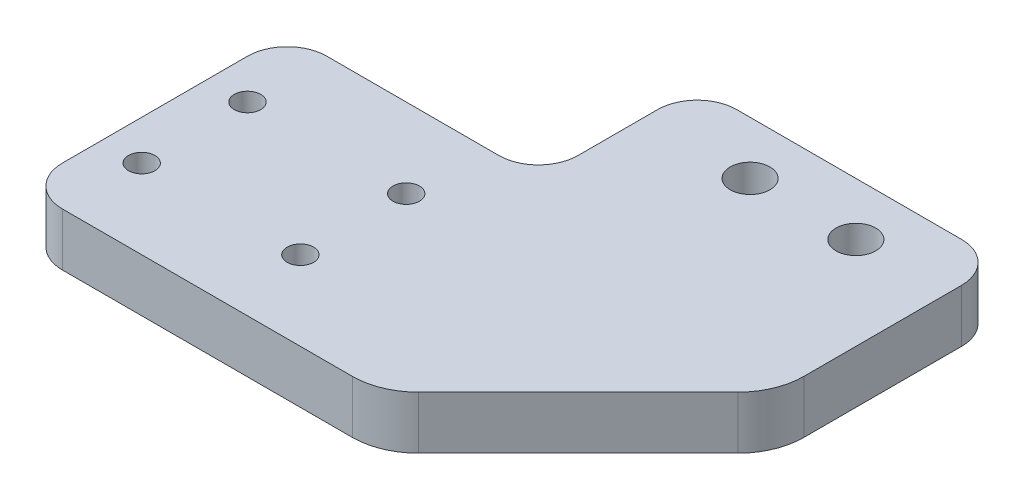
ISO-10303-21;
HEADER;
FILE_DESCRIPTION(('STEP AP214'),'2;1');
FILE_NAME('part.step','',(''),(''),'','','');
FILE_SCHEMA(('AUTOMOTIVE_DESIGN { 1 0 10303 214 1 1 1 1 }'));
ENDSEC;
DATA;
#1=APPLICATION_CONTEXT('core data for automotive mechanical design processes');
#2=APPLICATION_PROTOCOL_DEFINITION('international standard','automotive_design',2000,#1);
#3=PRODUCT_CONTEXT('',#1,'mechanical');
#4=PRODUCT('Part','Part','',(#3));
#5=PRODUCT_RELATED_PRODUCT_CATEGORY('part','',(#4));
#6=PRODUCT_DEFINITION_FORMATION('','',#4);
#7=PRODUCT_DEFINITION_CONTEXT('part definition',#1,'design');
#8=PRODUCT_DEFINITION('design','',#6,#7);
#9=PRODUCT_DEFINITION_SHAPE('','',#8);
#10=(LENGTH_UNIT() NAMED_UNIT(*) SI_UNIT(.MILLI.,.METRE.));
#11=(NAMED_UNIT(*) PLANE_ANGLE_UNIT() SI_UNIT($,.RADIAN.));
#12=(NAMED_UNIT(*) SI_UNIT($,.STERADIAN.) SOLID_ANGLE_UNIT());
#13=UNCERTAINTY_MEASURE_WITH_UNIT(LENGTH_MEASURE(1.E-05),#10,'distance_accuracy_value','');
#14=(GEOMETRIC_REPRESENTATION_CONTEXT(3) GLOBAL_UNCERTAINTY_ASSIGNED_CONTEXT((#13)) GLOBAL_UNIT_ASSIGNED_CONTEXT((#10,
#11,#12)) REPRESENTATION_CONTEXT('',''));
#15=CARTESIAN_POINT('',(0.,0.,0.));
#16=DIRECTION('',(0.,0.,1.));
#17=DIRECTION('',(1.,0.,0.));
#18=AXIS2_PLACEMENT_3D('',#15,#16,#17);
#19=CARTESIAN_POINT('',(0.,4.,10.));
#20=DIRECTION('',(0.,0.,1.));
#21=DIRECTION('',(1.,0.,0.));
#22=AXIS2_PLACEMENT_3D('',#19,#20,#21);
#23=PLANE('',#22);
#24=DIRECTION('',(-1.,0.,0.));
#25=VECTOR('',#24,1.);
#26=CARTESIAN_POINT('',(0.,0.,10.));
#27=LINE('',#26,#25);
#28=CARTESIAN_POINT('',(45.9289321881345,0.,10.));
#29=VERTEX_POINT('',#28);
#30=CARTESIAN_POINT('',(24.,0.,10.));
#31=VERTEX_POINT('',#30);
#32=EDGE_CURVE('E257',#29,#31,#27,.T.);
#33=ORIENTED_EDGE('',*,*,#32,.F.);
#34=DIRECTION('',(0.,-1.,0.));
#35=VECTOR('',#34,1.);
#36=CARTESIAN_POINT('',(45.9289321881345,4.,10.));
#37=LINE('',#36,#35);
#38=CARTESIAN_POINT('',(45.9289321881345,4.,10.));
#39=VERTEX_POINT('',#38);
#40=EDGE_CURVE('E11',#29,#39,#37,.F.);
#41=ORIENTED_EDGE('',*,*,#40,.T.);
#42=DIRECTION('',(-1.,0.,0.));
#43=VECTOR('',#42,1.);
#44=CARTESIAN_POINT('',(0.,4.,10.));
#45=LINE('',#44,#43);
#46=CARTESIAN_POINT('',(24.,4.,10.));
#47=VERTEX_POINT('',#46);
#48=EDGE_CURVE('E251',#39,#47,#45,.T.);
#49=ORIENTED_EDGE('',*,*,#48,.T.);
#50=DIRECTION('',(0.,-1.,0.));
#51=VECTOR('',#50,1.);
#52=CARTESIAN_POINT('',(24.,0.,10.));
#53=LINE('',#52,#51);
#54=EDGE_CURVE('E209',#47,#31,#53,.T.);
#55=ORIENTED_EDGE('',*,*,#54,.T.);
#56=EDGE_LOOP('',(#33,#41,#49,#55));
#57=FACE_BOUND('',#56,.T.);
#58=ADVANCED_FACE('F45',(#57),#23,.T.);
#59=CARTESIAN_POINT('',(63.,4.,0.));
#60=DIRECTION('',(1.,0.,0.));
#61=DIRECTION('',(0.,0.,-1.));
#62=AXIS2_PLACEMENT_3D('',#59,#60,#61);
#63=PLANE('',#62);
#64=DIRECTION('',(0.,0.,1.));
#65=VECTOR('',#64,1.);
#66=CARTESIAN_POINT('',(63.,4.,0.));
#67=LINE('',#66,#65);
#68=CARTESIAN_POINT('',(63.,4.,-19.));
#69=VERTEX_POINT('',#68);
#70=CARTESIAN_POINT('',(63.,4.,-7.07106781186549));
#71=VERTEX_POINT('',#70);
#72=EDGE_CURVE('E242',#69,#71,#67,.T.);
#73=ORIENTED_EDGE('',*,*,#72,.T.);
#74=DIRECTION('',(0.,1.,0.));
#75=VECTOR('',#74,1.);
#76=CARTESIAN_POINT('',(63.,4.,-7.07106781186549));
#77=LINE('',#76,#75);
#78=CARTESIAN_POINT('',(63.,0.,-7.07106781186549));
#79=VERTEX_POINT('',#78);
#80=EDGE_CURVE('E226',#71,#79,#77,.F.);
#81=ORIENTED_EDGE('',*,*,#80,.T.);
#82=DIRECTION('',(0.,0.,1.));
#83=VECTOR('',#82,1.);
#84=CARTESIAN_POINT('',(63.,0.,0.));
#85=LINE('',#84,#83);
#86=CARTESIAN_POINT('',(63.,0.,-19.));
#87=VERTEX_POINT('',#86);
#88=EDGE_CURVE('E171',#87,#79,#85,.T.);
#89=ORIENTED_EDGE('',*,*,#88,.F.);
#90=DIRECTION('',(0.,-1.,0.));
#91=VECTOR('',#90,1.);
#92=CARTESIAN_POINT('',(63.,4.,-19.));
#93=LINE('',#92,#91);
#94=EDGE_CURVE('E190',#87,#69,#93,.F.);
#95=ORIENTED_EDGE('',*,*,#94,.T.);
#96=EDGE_LOOP('',(#73,#81,#89,#95));
#97=FACE_BOUND('',#96,.T.);
#98=ADVANCED_FACE('F247',(#97),#63,.T.);
#99=CARTESIAN_POINT('',(0.,4.,-22.));
#100=DIRECTION('',(0.,0.,-1.));
#101=DIRECTION('',(-1.,0.,0.));
#102=AXIS2_PLACEMENT_3D('',#99,#100,#101);
#103=PLANE('',#102);
#104=DIRECTION('',(1.,0.,0.));
#105=VECTOR('',#104,1.);
#106=CARTESIAN_POINT('',(0.,4.,-22.));
#107=LINE('',#106,#105);
#108=CARTESIAN_POINT('',(43.,4.,-22.));
#109=VERTEX_POINT('',#108);
#110=CARTESIAN_POINT('',(60.,4.,-22.));
#111=VERTEX_POINT('',#110);
#112=EDGE_CURVE('E250',#109,#111,#107,.T.);
#113=ORIENTED_EDGE('',*,*,#112,.T.);
#114=DIRECTION('',(0.,-1.,0.));
#115=VECTOR('',#114,1.);
#116=CARTESIAN_POINT('',(60.,4.,-22.));
#117=LINE('',#116,#115);
#118=CARTESIAN_POINT('',(60.,0.,-22.));
#119=VERTEX_POINT('',#118);
#120=EDGE_CURVE('E170',#111,#119,#117,.T.);
#121=ORIENTED_EDGE('',*,*,#120,.T.);
#122=DIRECTION('',(1.,0.,0.));
#123=VECTOR('',#122,1.);
#124=CARTESIAN_POINT('',(0.,0.,-22.));
#125=LINE('',#124,#123);
#126=CARTESIAN_POINT('',(43.,0.,-22.));
#127=VERTEX_POINT('',#126);
#128=EDGE_CURVE('E153',#127,#119,#125,.T.);
#129=ORIENTED_EDGE('',*,*,#128,.F.);
#130=DIRECTION('',(0.,-1.,0.));
#131=VECTOR('',#130,1.);
#132=CARTESIAN_POINT('',(43.,4.,-22.));
#133=LINE('',#132,#131);
#134=EDGE_CURVE('E167',#127,#109,#133,.F.);
#135=ORIENTED_EDGE('',*,*,#134,.T.);
#136=EDGE_LOOP('',(#113,#121,#129,#135));
#137=FACE_BOUND('',#136,.T.);
#138=ADVANCED_FACE('F166',(#137),#103,.T.);
#139=CARTESIAN_POINT('',(40.,4.,0.));
#140=DIRECTION('',(-1.,0.,0.));
#141=DIRECTION('',(0.,0.,1.));
#142=AXIS2_PLACEMENT_3D('',#139,#140,#141);
#143=PLANE('',#142);
#144=DIRECTION('',(0.,0.,-1.));
#145=VECTOR('',#144,1.);
#146=CARTESIAN_POINT('',(40.,4.,0.));
#147=LINE('',#146,#145);
#148=CARTESIAN_POINT('',(40.,4.,-13.));
#149=VERTEX_POINT('',#148);
#150=CARTESIAN_POINT('',(40.,4.,-19.));
#151=VERTEX_POINT('',#150);
#152=EDGE_CURVE('E294',#149,#151,#147,.T.);
#153=ORIENTED_EDGE('',*,*,#152,.T.);
#154=DIRECTION('',(0.,-1.,0.));
#155=VECTOR('',#154,1.);
#156=CARTESIAN_POINT('',(40.,4.,-19.));
#157=LINE('',#156,#155);
#158=CARTESIAN_POINT('',(40.,0.,-19.));
#159=VERTEX_POINT('',#158);
#160=EDGE_CURVE('E202',#151,#159,#157,.T.);
#161=ORIENTED_EDGE('',*,*,#160,.T.);
#162=DIRECTION('',(0.,0.,-1.));
#163=VECTOR('',#162,1.);
#164=CARTESIAN_POINT('',(40.,0.,0.));
#165=LINE('',#164,#163);
#166=CARTESIAN_POINT('',(40.,0.,-13.));
#167=VERTEX_POINT('',#166);
#168=EDGE_CURVE('E155',#167,#159,#165,.T.);
#169=ORIENTED_EDGE('',*,*,#168,.F.);
#170=DIRECTION('',(0.,-1.,0.));
#171=VECTOR('',#170,1.);
#172=CARTESIAN_POINT('',(40.,4.,-13.));
#173=LINE('',#172,#171);
#174=EDGE_CURVE('E200',#167,#149,#173,.F.);
#175=ORIENTED_EDGE('',*,*,#174,.T.);
#176=EDGE_LOOP('',(#153,#161,#169,#175));
#177=FACE_BOUND('',#176,.T.);
#178=ADVANCED_FACE('F448',(#177),#143,.T.);
#179=CARTESIAN_POINT('',(0.,4.,-10.));
#180=DIRECTION('',(0.,0.,-1.));
#181=DIRECTION('',(-1.,0.,0.));
#182=AXIS2_PLACEMENT_3D('',#179,#180,#181);
#183=PLANE('',#182);
#184=DIRECTION('',(1.,0.,0.));
#185=VECTOR('',#184,1.);
#186=CARTESIAN_POINT('',(0.,4.,-10.));
#187=LINE('',#186,#185);
#188=CARTESIAN_POINT('',(24.,4.,-10.));
#189=VERTEX_POINT('',#188);
#190=CARTESIAN_POINT('',(37.,4.,-10.));
#191=VERTEX_POINT('',#190);
#192=EDGE_CURVE('E297',#189,#191,#187,.T.);
#193=ORIENTED_EDGE('',*,*,#192,.T.);
#194=DIRECTION('',(0.,-1.,0.));
#195=VECTOR('',#194,1.);
#196=CARTESIAN_POINT('',(37.,0.,-10.));
#197=LINE('',#196,#195);
#198=CARTESIAN_POINT('',(37.,0.,-10.));
#199=VERTEX_POINT('',#198);
#200=EDGE_CURVE('E206',#191,#199,#197,.T.);
#201=ORIENTED_EDGE('',*,*,#200,.T.);
#202=DIRECTION('',(1.,0.,0.));
#203=VECTOR('',#202,1.);
#204=CARTESIAN_POINT('',(0.,0.,-10.));
#205=LINE('',#204,#203);
#206=CARTESIAN_POINT('',(24.,0.,-10.));
#207=VERTEX_POINT('',#206);
#208=EDGE_CURVE('E267',#207,#199,#205,.T.);
#209=ORIENTED_EDGE('',*,*,#208,.F.);
#210=DIRECTION('',(0.,-1.,0.));
#211=VECTOR('',#210,1.);
#212=CARTESIAN_POINT('',(24.,4.,-10.));
#213=LINE('',#212,#211);
#214=EDGE_CURVE('E204',#207,#189,#213,.F.);
#215=ORIENTED_EDGE('',*,*,#214,.T.);
#216=EDGE_LOOP('',(#193,#201,#209,#215));
#217=FACE_BOUND('',#216,.T.);
#218=ADVANCED_FACE('F456',(#217),#183,.T.);
#219=CARTESIAN_POINT('',(56.,4.,-18.));
#220=DIRECTION('',(0.,-1.,0.));
#221=DIRECTION('',(0.,0.,-1.));
#222=AXIS2_PLACEMENT_3D('',#219,#220,#221);
#223=CYLINDRICAL_SURFACE('',#222,1.5);
#224=CARTESIAN_POINT('',(56.,4.,-18.));
#225=DIRECTION('',(0.,1.,0.));
#226=DIRECTION('',(0.,0.,1.));
#227=AXIS2_PLACEMENT_3D('',#224,#225,#226);
#228=CIRCLE('',#227,1.5);
#229=CARTESIAN_POINT('',(56.,4.,-16.5));
#230=VERTEX_POINT('',#229);
#231=EDGE_CURVE('E181',#230,#230,#228,.T.);
#232=ORIENTED_EDGE('',*,*,#231,.T.);
#233=EDGE_LOOP('',(#232));
#234=FACE_BOUND('',#233,.T.);
#235=CARTESIAN_POINT('',(56.,0.,-18.));
#236=DIRECTION('',(0.,1.,0.));
#237=DIRECTION('',(0.,0.,1.));
#238=AXIS2_PLACEMENT_3D('',#235,#236,#237);
#239=CIRCLE('',#238,1.5);
#240=CARTESIAN_POINT('',(56.,0.,-16.5));
#241=VERTEX_POINT('',#240);
#242=EDGE_CURVE('E284',#241,#241,#239,.T.);
#243=ORIENTED_EDGE('',*,*,#242,.F.);
#244=EDGE_LOOP('',(#243));
#245=FACE_BOUND('',#244,.T.);
#246=ADVANCED_FACE('F317',(#234,#245),#223,.F.);
#247=CARTESIAN_POINT('',(24.,4.,4.));
#248=DIRECTION('',(0.,-1.,0.));
#249=DIRECTION('',(0.,0.,-1.));
#250=AXIS2_PLACEMENT_3D('',#247,#248,#249);
#251=CYLINDRICAL_SURFACE('',#250,1.);
#252=CARTESIAN_POINT('',(24.,4.,4.));
#253=DIRECTION('',(0.,1.,0.));
#254=DIRECTION('',(0.,0.,1.));
#255=AXIS2_PLACEMENT_3D('',#252,#253,#254);
#256=CIRCLE('',#255,1.);
#257=CARTESIAN_POINT('',(24.,4.,5.));
#258=VERTEX_POINT('',#257);
#259=EDGE_CURVE('E312',#258,#258,#256,.F.);
#260=ORIENTED_EDGE('',*,*,#259,.F.);
#261=EDGE_LOOP('',(#260));
#262=FACE_BOUND('',#261,.T.);
#263=CARTESIAN_POINT('',(24.,0.,4.));
#264=DIRECTION('',(0.,1.,0.));
#265=DIRECTION('',(0.,0.,1.));
#266=AXIS2_PLACEMENT_3D('',#263,#264,#265);
#267=CIRCLE('',#266,1.);
#268=CARTESIAN_POINT('',(24.,0.,5.));
#269=VERTEX_POINT('',#268);
#270=EDGE_CURVE('E282',#269,#269,#267,.F.);
#271=ORIENTED_EDGE('',*,*,#270,.T.);
#272=EDGE_LOOP('',(#271));
#273=FACE_BOUND('',#272,.T.);
#274=ADVANCED_FACE('F475',(#262,#273),#251,.F.);
#275=CARTESIAN_POINT('',(36.,4.,4.));
#276=DIRECTION('',(0.,-1.,0.));
#277=DIRECTION('',(0.,0.,-1.));
#278=AXIS2_PLACEMENT_3D('',#275,#276,#277);
#279=CYLINDRICAL_SURFACE('',#278,0.999999999999998);
#280=CARTESIAN_POINT('',(36.,4.,4.));
#281=DIRECTION('',(0.,1.,0.));
#282=DIRECTION('',(0.,0.,1.));
#283=AXIS2_PLACEMENT_3D('',#280,#281,#282);
#284=CIRCLE('',#283,0.999999999999998);
#285=CARTESIAN_POINT('',(36.,4.,5.));
#286=VERTEX_POINT('',#285);
#287=EDGE_CURVE('E309',#286,#286,#284,.T.);
#288=ORIENTED_EDGE('',*,*,#287,.T.);
#289=EDGE_LOOP('',(#288));
#290=FACE_BOUND('',#289,.T.);
#291=CARTESIAN_POINT('',(36.,0.,4.));
#292=DIRECTION('',(0.,1.,0.));
#293=DIRECTION('',(0.,0.,1.));
#294=AXIS2_PLACEMENT_3D('',#291,#292,#293);
#295=CIRCLE('',#294,0.999999999999998);
#296=CARTESIAN_POINT('',(36.,0.,5.));
#297=VERTEX_POINT('',#296);
#298=EDGE_CURVE('E279',#297,#297,#295,.T.);
#299=ORIENTED_EDGE('',*,*,#298,.F.);
#300=EDGE_LOOP('',(#299));
#301=FACE_BOUND('',#300,.T.);
#302=ADVANCED_FACE('F483',(#290,#301),#279,.F.);
#303=CARTESIAN_POINT('',(24.,4.,-4.));
#304=DIRECTION('',(0.,-1.,0.));
#305=DIRECTION('',(0.,0.,-1.));
#306=AXIS2_PLACEMENT_3D('',#303,#304,#305);
#307=CYLINDRICAL_SURFACE('',#306,1.);
#308=CARTESIAN_POINT('',(24.,4.,-4.));
#309=DIRECTION('',(0.,1.,0.));
#310=DIRECTION('',(0.,0.,1.));
#311=AXIS2_PLACEMENT_3D('',#308,#309,#310);
#312=CIRCLE('',#311,1.);
#313=CARTESIAN_POINT('',(24.,4.,-3.));
#314=VERTEX_POINT('',#313);
#315=EDGE_CURVE('E306',#314,#314,#312,.T.);
#316=ORIENTED_EDGE('',*,*,#315,.T.);
#317=EDGE_LOOP('',(#316));
#318=FACE_BOUND('',#317,.T.);
#319=CARTESIAN_POINT('',(24.,0.,-4.));
#320=DIRECTION('',(0.,1.,0.));
#321=DIRECTION('',(0.,0.,1.));
#322=AXIS2_PLACEMENT_3D('',#319,#320,#321);
#323=CIRCLE('',#322,1.);
#324=CARTESIAN_POINT('',(24.,0.,-3.));
#325=VERTEX_POINT('',#324);
#326=EDGE_CURVE('E276',#325,#325,#323,.T.);
#327=ORIENTED_EDGE('',*,*,#326,.F.);
#328=EDGE_LOOP('',(#327));
#329=FACE_BOUND('',#328,.T.);
#330=ADVANCED_FACE('F493',(#318,#329),#307,.F.);
#331=CARTESIAN_POINT('',(36.,4.,-4.));
#332=DIRECTION('',(0.,-1.,0.));
#333=DIRECTION('',(0.,0.,-1.));
#334=AXIS2_PLACEMENT_3D('',#331,#332,#333);
#335=CYLINDRICAL_SURFACE('',#334,0.999999999999998);
#336=CARTESIAN_POINT('',(36.,4.,-4.));
#337=DIRECTION('',(0.,1.,0.));
#338=DIRECTION('',(0.,0.,1.));
#339=AXIS2_PLACEMENT_3D('',#336,#337,#338);
#340=CIRCLE('',#339,0.999999999999998);
#341=CARTESIAN_POINT('',(36.,4.,-3.));
#342=VERTEX_POINT('',#341);
#343=EDGE_CURVE('E303',#342,#342,#340,.F.);
#344=ORIENTED_EDGE('',*,*,#343,.F.);
#345=EDGE_LOOP('',(#344));
#346=FACE_BOUND('',#345,.T.);
#347=CARTESIAN_POINT('',(36.,0.,-4.));
#348=DIRECTION('',(0.,1.,0.));
#349=DIRECTION('',(0.,0.,1.));
#350=AXIS2_PLACEMENT_3D('',#347,#348,#349);
#351=CIRCLE('',#350,0.999999999999998);
#352=CARTESIAN_POINT('',(36.,0.,-3.));
#353=VERTEX_POINT('',#352);
#354=EDGE_CURVE('E273',#353,#353,#351,.F.);
#355=ORIENTED_EDGE('',*,*,#354,.T.);
#356=EDGE_LOOP('',(#355));
#357=FACE_BOUND('',#356,.T.);
#358=ADVANCED_FACE('F335',(#346,#357),#335,.F.);
#359=CARTESIAN_POINT('',(21.,4.,0.));
#360=DIRECTION('',(1.,0.,0.));
#361=DIRECTION('',(0.,0.,-1.));
#362=AXIS2_PLACEMENT_3D('',#359,#360,#361);
#363=PLANE('',#362);
#364=DIRECTION('',(0.,0.,1.));
#365=VECTOR('',#364,1.);
#366=CARTESIAN_POINT('',(21.,0.,0.));
#367=LINE('',#366,#365);
#368=CARTESIAN_POINT('',(21.,0.,-7.));
#369=VERTEX_POINT('',#368);
#370=CARTESIAN_POINT('',(21.,0.,7.));
#371=VERTEX_POINT('',#370);
#372=EDGE_CURVE('E270',#369,#371,#367,.T.);
#373=ORIENTED_EDGE('',*,*,#372,.T.);
#374=DIRECTION('',(0.,-1.,0.));
#375=VECTOR('',#374,1.);
#376=CARTESIAN_POINT('',(21.,4.,7.));
#377=LINE('',#376,#375);
#378=CARTESIAN_POINT('',(21.,4.,7.));
#379=VERTEX_POINT('',#378);
#380=EDGE_CURVE('E215',#371,#379,#377,.F.);
#381=ORIENTED_EDGE('',*,*,#380,.T.);
#382=DIRECTION('',(0.,0.,1.));
#383=VECTOR('',#382,1.);
#384=CARTESIAN_POINT('',(21.,4.,0.));
#385=LINE('',#384,#383);
#386=CARTESIAN_POINT('',(21.,4.,-7.));
#387=VERTEX_POINT('',#386);
#388=EDGE_CURVE('E300',#387,#379,#385,.T.);
#389=ORIENTED_EDGE('',*,*,#388,.F.);
#390=DIRECTION('',(0.,-1.,0.));
#391=VECTOR('',#390,1.);
#392=CARTESIAN_POINT('',(21.,0.,-7.));
#393=LINE('',#392,#391);
#394=EDGE_CURVE('E212',#387,#369,#393,.T.);
#395=ORIENTED_EDGE('',*,*,#394,.T.);
#396=EDGE_LOOP('',(#373,#381,#389,#395));
#397=FACE_BOUND('',#396,.T.);
#398=ADVANCED_FACE('F328',(#397),#363,.F.);
#399=CARTESIAN_POINT('',(48.,4.,-18.));
#400=DIRECTION('',(0.,-1.,0.));
#401=DIRECTION('',(0.,0.,-1.));
#402=AXIS2_PLACEMENT_3D('',#399,#400,#401);
#403=CYLINDRICAL_SURFACE('',#402,1.5);
#404=CARTESIAN_POINT('',(48.,4.,-18.));
#405=DIRECTION('',(0.,1.,0.));
#406=DIRECTION('',(0.,0.,1.));
#407=AXIS2_PLACEMENT_3D('',#404,#405,#406);
#408=CIRCLE('',#407,1.5);
#409=CARTESIAN_POINT('',(48.,4.,-16.5));
#410=VERTEX_POINT('',#409);
#411=EDGE_CURVE('E176',#410,#410,#408,.T.);
#412=ORIENTED_EDGE('',*,*,#411,.T.);
#413=EDGE_LOOP('',(#412));
#414=FACE_BOUND('',#413,.T.);
#415=CARTESIAN_POINT('',(48.,0.,-18.));
#416=DIRECTION('',(0.,1.,0.));
#417=DIRECTION('',(0.,0.,1.));
#418=AXIS2_PLACEMENT_3D('',#415,#416,#417);
#419=CIRCLE('',#418,1.5);
#420=CARTESIAN_POINT('',(48.,0.,-16.5));
#421=VERTEX_POINT('',#420);
#422=EDGE_CURVE('E184',#421,#421,#419,.T.);
#423=ORIENTED_EDGE('',*,*,#422,.F.);
#424=EDGE_LOOP('',(#423));
#425=FACE_BOUND('',#424,.T.);
#426=ADVANCED_FACE('F322',(#414,#425),#403,.F.);
#427=CARTESIAN_POINT('',(0.,4.,0.));
#428=DIRECTION('',(0.,1.,0.));
#429=DIRECTION('',(0.,0.,1.));
#430=AXIS2_PLACEMENT_3D('',#427,#428,#429);
#431=PLANE('',#430);
#432=DIRECTION('',(-0.707106781186549,0.,0.707106781186546));
#433=VECTOR('',#432,1.);
#434=CARTESIAN_POINT('',(28.9999999999999,4.,29.));
#435=LINE('',#434,#433);
#436=CARTESIAN_POINT('',(49.4644660940672,4.,8.53553390593275));
#437=VERTEX_POINT('',#436);
#438=CARTESIAN_POINT('',(61.5355339059327,4.,-3.53553390593276));
#439=VERTEX_POINT('',#438);
#440=EDGE_CURVE('E224',#437,#439,#435,.F.);
#441=ORIENTED_EDGE('',*,*,#440,.T.);
#442=CARTESIAN_POINT('',(58.,4.,-7.07106781186549));
#443=DIRECTION('',(0.,1.,0.));
#444=DIRECTION('',(0.,0.,1.));
#445=AXIS2_PLACEMENT_3D('',#442,#443,#444);
#446=CIRCLE('',#445,5.);
#447=EDGE_CURVE('E53',#439,#71,#446,.T.);
#448=ORIENTED_EDGE('',*,*,#447,.T.);
#449=ORIENTED_EDGE('',*,*,#72,.F.);
#450=CARTESIAN_POINT('',(60.,4.,-19.));
#451=DIRECTION('',(0.,1.,0.));
#452=DIRECTION('',(0.,0.,1.));
#453=AXIS2_PLACEMENT_3D('',#450,#451,#452);
#454=CIRCLE('',#453,3.);
#455=EDGE_CURVE('E198',#69,#111,#454,.T.);
#456=ORIENTED_EDGE('',*,*,#455,.T.);
#457=ORIENTED_EDGE('',*,*,#112,.F.);
#458=CARTESIAN_POINT('',(43.,4.,-19.));
#459=DIRECTION('',(0.,1.,0.));
#460=DIRECTION('',(0.,0.,1.));
#461=AXIS2_PLACEMENT_3D('',#458,#459,#460);
#462=CIRCLE('',#461,3.);
#463=EDGE_CURVE('E175',#109,#151,#462,.T.);
#464=ORIENTED_EDGE('',*,*,#463,.T.);
#465=ORIENTED_EDGE('',*,*,#152,.F.);
#466=CARTESIAN_POINT('',(37.,4.,-13.));
#467=DIRECTION('',(0.,1.,0.));
#468=DIRECTION('',(0.,0.,1.));
#469=AXIS2_PLACEMENT_3D('',#466,#467,#468);
#470=CIRCLE('',#469,3.);
#471=EDGE_CURVE('E219',#149,#191,#470,.F.);
#472=ORIENTED_EDGE('',*,*,#471,.T.);
#473=ORIENTED_EDGE('',*,*,#192,.F.);
#474=CARTESIAN_POINT('',(24.,4.,-7.));
#475=DIRECTION('',(0.,1.,0.));
#476=DIRECTION('',(0.,0.,1.));
#477=AXIS2_PLACEMENT_3D('',#474,#475,#476);
#478=CIRCLE('',#477,3.);
#479=EDGE_CURVE('E192',#189,#387,#478,.T.);
#480=ORIENTED_EDGE('',*,*,#479,.T.);
#481=ORIENTED_EDGE('',*,*,#388,.T.);
#482=CARTESIAN_POINT('',(24.,4.,7.));
#483=DIRECTION('',(0.,1.,0.));
#484=DIRECTION('',(0.,0.,1.));
#485=AXIS2_PLACEMENT_3D('',#482,#483,#484);
#486=CIRCLE('',#485,3.);
#487=EDGE_CURVE('E194',#379,#47,#486,.T.);
#488=ORIENTED_EDGE('',*,*,#487,.T.);
#489=ORIENTED_EDGE('',*,*,#48,.F.);
#490=CARTESIAN_POINT('',(45.9289321881345,4.,5.));
#491=DIRECTION('',(0.,1.,0.));
#492=DIRECTION('',(0.,0.,1.));
#493=AXIS2_PLACEMENT_3D('',#490,#491,#492);
#494=CIRCLE('',#493,5.);
#495=EDGE_CURVE('E60',#39,#437,#494,.T.);
#496=ORIENTED_EDGE('',*,*,#495,.T.);
#497=EDGE_LOOP('',(#441,#448,#449,#456,#457,#464,#465,#472,#473,#480,#481,#488,#489,#496));
#498=FACE_BOUND('',#497,.T.);
#499=ORIENTED_EDGE('',*,*,#343,.T.);
#500=EDGE_LOOP('',(#499));
#501=FACE_BOUND('',#500,.T.);
#502=ORIENTED_EDGE('',*,*,#315,.F.);
#503=EDGE_LOOP('',(#502));
#504=FACE_BOUND('',#503,.T.);
#505=ORIENTED_EDGE('',*,*,#287,.F.);
#506=EDGE_LOOP('',(#505));
#507=FACE_BOUND('',#506,.T.);
#508=ORIENTED_EDGE('',*,*,#259,.T.);
#509=EDGE_LOOP('',(#508));
#510=FACE_BOUND('',#509,.T.);
#511=ORIENTED_EDGE('',*,*,#231,.F.);
#512=EDGE_LOOP('',(#511));
#513=FACE_BOUND('',#512,.T.);
#514=ORIENTED_EDGE('',*,*,#411,.F.);
#515=EDGE_LOOP('',(#514));
#516=FACE_BOUND('',#515,.T.);
#517=ADVANCED_FACE('F240',(#498,#501,#504,#507,#510,#513,#516),#431,.T.);
#518=CARTESIAN_POINT('',(0.,0.,0.));
#519=DIRECTION('',(0.,1.,0.));
#520=DIRECTION('',(0.,0.,1.));
#521=AXIS2_PLACEMENT_3D('',#518,#519,#520);
#522=PLANE('',#521);
#523=ORIENTED_EDGE('',*,*,#88,.T.);
#524=CARTESIAN_POINT('',(58.,0.,-7.07106781186549));
#525=DIRECTION('',(0.,1.,0.));
#526=DIRECTION('',(0.,0.,1.));
#527=AXIS2_PLACEMENT_3D('',#524,#525,#526);
#528=CIRCLE('',#527,5.);
#529=CARTESIAN_POINT('',(61.5355339059327,0.,-3.53553390593275));
#530=VERTEX_POINT('',#529);
#531=EDGE_CURVE('E231',#79,#530,#528,.F.);
#532=ORIENTED_EDGE('',*,*,#531,.T.);
#533=DIRECTION('',(0.707106781186549,0.,-0.707106781186546));
#534=VECTOR('',#533,1.);
#535=CARTESIAN_POINT('',(63.,0.,-5.00000000000001));
#536=LINE('',#535,#534);
#537=CARTESIAN_POINT('',(49.4644660940672,0.,8.53553390593275));
#538=VERTEX_POINT('',#537);
#539=EDGE_CURVE('E221',#530,#538,#536,.F.);
#540=ORIENTED_EDGE('',*,*,#539,.T.);
#541=CARTESIAN_POINT('',(45.9289321881345,0.,5.));
#542=DIRECTION('',(0.,1.,0.));
#543=DIRECTION('',(0.,0.,1.));
#544=AXIS2_PLACEMENT_3D('',#541,#542,#543);
#545=CIRCLE('',#544,5.);
#546=EDGE_CURVE('E229',#538,#29,#545,.F.);
#547=ORIENTED_EDGE('',*,*,#546,.T.);
#548=ORIENTED_EDGE('',*,*,#32,.T.);
#549=CARTESIAN_POINT('',(24.,0.,7.));
#550=DIRECTION('',(0.,1.,0.));
#551=DIRECTION('',(0.,0.,1.));
#552=AXIS2_PLACEMENT_3D('',#549,#550,#551);
#553=CIRCLE('',#552,3.);
#554=EDGE_CURVE('E161',#31,#371,#553,.F.);
#555=ORIENTED_EDGE('',*,*,#554,.T.);
#556=ORIENTED_EDGE('',*,*,#372,.F.);
#557=CARTESIAN_POINT('',(24.,0.,-7.));
#558=DIRECTION('',(0.,1.,0.));
#559=DIRECTION('',(0.,0.,1.));
#560=AXIS2_PLACEMENT_3D('',#557,#558,#559);
#561=CIRCLE('',#560,3.);
#562=EDGE_CURVE('E178',#369,#207,#561,.F.);
#563=ORIENTED_EDGE('',*,*,#562,.T.);
#564=ORIENTED_EDGE('',*,*,#208,.T.);
#565=CARTESIAN_POINT('',(37.,0.,-13.));
#566=DIRECTION('',(0.,1.,0.));
#567=DIRECTION('',(0.,0.,1.));
#568=AXIS2_PLACEMENT_3D('',#565,#566,#567);
#569=CIRCLE('',#568,3.);
#570=EDGE_CURVE('E217',#199,#167,#569,.T.);
#571=ORIENTED_EDGE('',*,*,#570,.T.);
#572=ORIENTED_EDGE('',*,*,#168,.T.);
#573=CARTESIAN_POINT('',(43.,0.,-19.));
#574=DIRECTION('',(0.,1.,0.));
#575=DIRECTION('',(0.,0.,1.));
#576=AXIS2_PLACEMENT_3D('',#573,#574,#575);
#577=CIRCLE('',#576,3.);
#578=EDGE_CURVE('E148',#159,#127,#577,.F.);
#579=ORIENTED_EDGE('',*,*,#578,.T.);
#580=ORIENTED_EDGE('',*,*,#128,.T.);
#581=CARTESIAN_POINT('',(60.,0.,-19.));
#582=DIRECTION('',(0.,1.,0.));
#583=DIRECTION('',(0.,0.,1.));
#584=AXIS2_PLACEMENT_3D('',#581,#582,#583);
#585=CIRCLE('',#584,3.);
#586=EDGE_CURVE('E160',#119,#87,#585,.F.);
#587=ORIENTED_EDGE('',*,*,#586,.T.);
#588=EDGE_LOOP('',(#523,#532,#540,#547,#548,#555,#556,#563,#564,#571,#572,#579,#580,#587));
#589=FACE_BOUND('',#588,.T.);
#590=ORIENTED_EDGE('',*,*,#354,.F.);
#591=EDGE_LOOP('',(#590));
#592=FACE_BOUND('',#591,.T.);
#593=ORIENTED_EDGE('',*,*,#326,.T.);
#594=EDGE_LOOP('',(#593));
#595=FACE_BOUND('',#594,.T.);
#596=ORIENTED_EDGE('',*,*,#298,.T.);
#597=EDGE_LOOP('',(#596));
#598=FACE_BOUND('',#597,.T.);
#599=ORIENTED_EDGE('',*,*,#270,.F.);
#600=EDGE_LOOP('',(#599));
#601=FACE_BOUND('',#600,.T.);
#602=ORIENTED_EDGE('',*,*,#242,.T.);
#603=EDGE_LOOP('',(#602));
#604=FACE_BOUND('',#603,.T.);
#605=ORIENTED_EDGE('',*,*,#422,.T.);
#606=EDGE_LOOP('',(#605));
#607=FACE_BOUND('',#606,.T.);
#608=ADVANCED_FACE('F151',(#589,#592,#595,#598,#601,#604,#607),#522,.F.);
#609=CARTESIAN_POINT('',(60.,4.,-19.));
#610=DIRECTION('',(0.,-1.,0.));
#611=DIRECTION('',(0.,0.,-1.));
#612=AXIS2_PLACEMENT_3D('',#609,#610,#611);
#613=CYLINDRICAL_SURFACE('',#612,3.);
#614=ORIENTED_EDGE('',*,*,#455,.F.);
#615=ORIENTED_EDGE('',*,*,#94,.F.);
#616=ORIENTED_EDGE('',*,*,#586,.F.);
#617=ORIENTED_EDGE('',*,*,#120,.F.);
#618=EDGE_LOOP('',(#614,#615,#616,#617));
#619=FACE_BOUND('',#618,.T.);
#620=ADVANCED_FACE('F349',(#619),#613,.T.);
#621=CARTESIAN_POINT('',(43.,4.,-19.));
#622=DIRECTION('',(0.,-1.,0.));
#623=DIRECTION('',(0.,0.,-1.));
#624=AXIS2_PLACEMENT_3D('',#621,#622,#623);
#625=CYLINDRICAL_SURFACE('',#624,3.);
#626=ORIENTED_EDGE('',*,*,#463,.F.);
#627=ORIENTED_EDGE('',*,*,#134,.F.);
#628=ORIENTED_EDGE('',*,*,#578,.F.);
#629=ORIENTED_EDGE('',*,*,#160,.F.);
#630=EDGE_LOOP('',(#626,#627,#628,#629));
#631=FACE_BOUND('',#630,.T.);
#632=ADVANCED_FACE('F174',(#631),#625,.T.);
#633=CARTESIAN_POINT('',(37.,4.,-13.));
#634=DIRECTION('',(0.,1.,0.));
#635=DIRECTION('',(0.,0.,1.));
#636=AXIS2_PLACEMENT_3D('',#633,#634,#635);
#637=CYLINDRICAL_SURFACE('',#636,3.);
#638=ORIENTED_EDGE('',*,*,#471,.F.);
#639=ORIENTED_EDGE('',*,*,#174,.F.);
#640=ORIENTED_EDGE('',*,*,#570,.F.);
#641=ORIENTED_EDGE('',*,*,#200,.F.);
#642=EDGE_LOOP('',(#638,#639,#640,#641));
#643=FACE_BOUND('',#642,.T.);
#644=ADVANCED_FACE('F355',(#643),#637,.F.);
#645=CARTESIAN_POINT('',(24.,4.,7.));
#646=DIRECTION('',(0.,1.,0.));
#647=DIRECTION('',(0.,0.,1.));
#648=AXIS2_PLACEMENT_3D('',#645,#646,#647);
#649=CYLINDRICAL_SURFACE('',#648,3.);
#650=ORIENTED_EDGE('',*,*,#487,.F.);
#651=ORIENTED_EDGE('',*,*,#380,.F.);
#652=ORIENTED_EDGE('',*,*,#554,.F.);
#653=ORIENTED_EDGE('',*,*,#54,.F.);
#654=EDGE_LOOP('',(#650,#651,#652,#653));
#655=FACE_BOUND('',#654,.T.);
#656=ADVANCED_FACE('F358',(#655),#649,.T.);
#657=CARTESIAN_POINT('',(24.,4.,-7.));
#658=DIRECTION('',(0.,1.,0.));
#659=DIRECTION('',(0.,0.,1.));
#660=AXIS2_PLACEMENT_3D('',#657,#658,#659);
#661=CYLINDRICAL_SURFACE('',#660,3.);
#662=ORIENTED_EDGE('',*,*,#479,.F.);
#663=ORIENTED_EDGE('',*,*,#214,.F.);
#664=ORIENTED_EDGE('',*,*,#562,.F.);
#665=ORIENTED_EDGE('',*,*,#394,.F.);
#666=EDGE_LOOP('',(#662,#663,#664,#665));
#667=FACE_BOUND('',#666,.T.);
#668=ADVANCED_FACE('F362',(#667),#661,.T.);
#669=CARTESIAN_POINT('',(63.,4.,-5.00000000000001));
#670=DIRECTION('',(-0.707106781186546,0.,-0.707106781186549));
#671=DIRECTION('',(0.,-1.,0.));
#672=AXIS2_PLACEMENT_3D('',#669,#670,#671);
#673=PLANE('',#672);
#674=ORIENTED_EDGE('',*,*,#539,.F.);
#675=DIRECTION('',(0.,-1.,0.));
#676=VECTOR('',#675,1.);
#677=CARTESIAN_POINT('',(61.5355339059327,4.,-3.53553390593275));
#678=LINE('',#677,#676);
#679=EDGE_CURVE('E67',#530,#439,#678,.F.);
#680=ORIENTED_EDGE('',*,*,#679,.T.);
#681=ORIENTED_EDGE('',*,*,#440,.F.);
#682=DIRECTION('',(0.,1.,0.));
#683=VECTOR('',#682,1.);
#684=CARTESIAN_POINT('',(49.4644660940672,4.,8.53553390593275));
#685=LINE('',#684,#683);
#686=EDGE_CURVE('E233',#437,#538,#685,.F.);
#687=ORIENTED_EDGE('',*,*,#686,.T.);
#688=EDGE_LOOP('',(#674,#680,#681,#687));
#689=FACE_BOUND('',#688,.T.);
#690=ADVANCED_FACE('F255',(#689),#673,.F.);
#691=CARTESIAN_POINT('',(58.,4.,-7.07106781186549));
#692=DIRECTION('',(0.,1.,0.));
#693=DIRECTION('',(0.,0.,1.));
#694=AXIS2_PLACEMENT_3D('',#691,#692,#693);
#695=CYLINDRICAL_SURFACE('',#694,5.);
#696=ORIENTED_EDGE('',*,*,#447,.F.);
#697=ORIENTED_EDGE('',*,*,#679,.F.);
#698=ORIENTED_EDGE('',*,*,#531,.F.);
#699=ORIENTED_EDGE('',*,*,#80,.F.);
#700=EDGE_LOOP('',(#696,#697,#698,#699));
#701=FACE_BOUND('',#700,.T.);
#702=ADVANCED_FACE('F253',(#701),#695,.T.);
#703=CARTESIAN_POINT('',(45.9289321881345,4.,5.));
#704=DIRECTION('',(0.,-1.,0.));
#705=DIRECTION('',(0.,0.,-1.));
#706=AXIS2_PLACEMENT_3D('',#703,#704,#705);
#707=CYLINDRICAL_SURFACE('',#706,5.);
#708=ORIENTED_EDGE('',*,*,#546,.F.);
#709=ORIENTED_EDGE('',*,*,#686,.F.);
#710=ORIENTED_EDGE('',*,*,#495,.F.);
#711=ORIENTED_EDGE('',*,*,#40,.F.);
#712=EDGE_LOOP('',(#708,#709,#710,#711));
#713=FACE_BOUND('',#712,.T.);
#714=ADVANCED_FACE('F47',(#713),#707,.T.);
#715=CLOSED_SHELL('',(#58,#98,#138,#178,#218,#246,#274,#302,#330,#358,#398,#426,#517,#608,#620,
#632,#644,#656,#668,#690,#702,#714));
#716=MANIFOLD_SOLID_BREP('B2',#715);
#717=ADVANCED_BREP_SHAPE_REPRESENTATION('',(#18,#716),#14);
#718=SHAPE_DEFINITION_REPRESENTATION(#9,#717);
ENDSEC;
END-ISO-10303-21;
